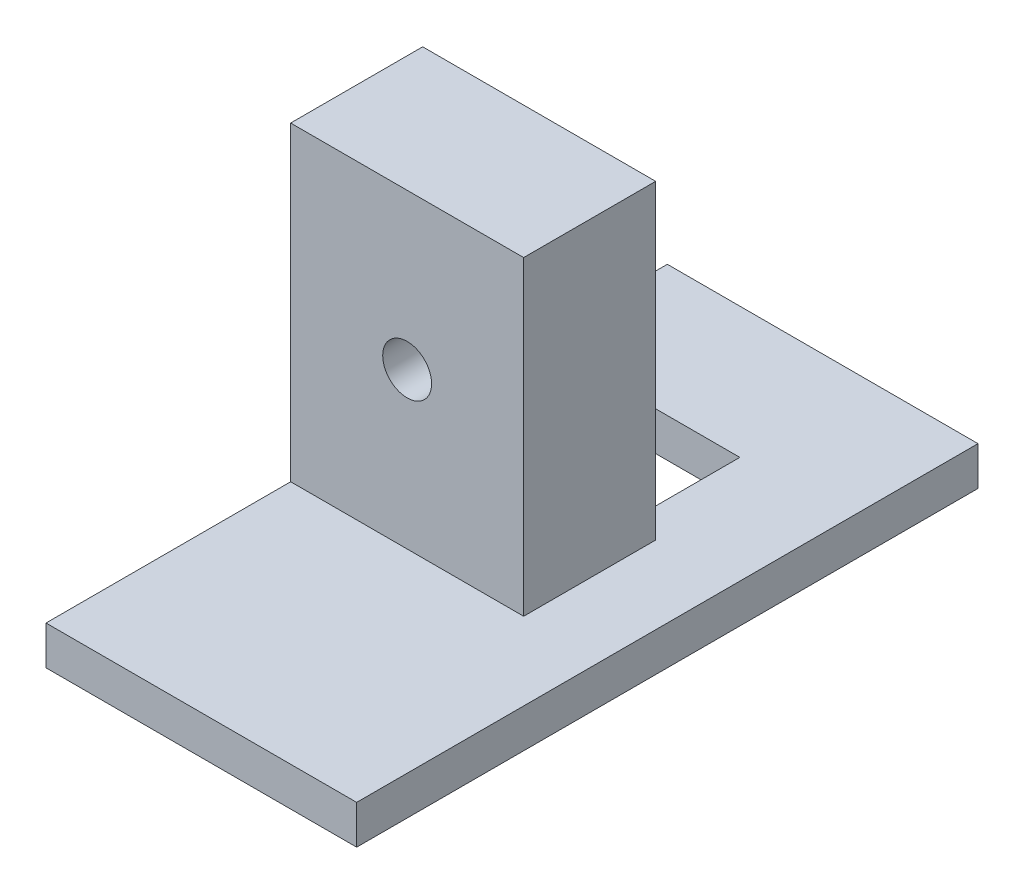
ISO-10303-21;
HEADER;
FILE_DESCRIPTION(('STEP AP214'),'2;1');
FILE_NAME('part.step','',(''),(''),'','','');
FILE_SCHEMA(('AUTOMOTIVE_DESIGN { 1 0 10303 214 1 1 1 1 }'));
ENDSEC;
DATA;
#1=APPLICATION_CONTEXT('core data for automotive mechanical design processes');
#2=APPLICATION_PROTOCOL_DEFINITION('international standard','automotive_design',2000,#1);
#3=PRODUCT_CONTEXT('',#1,'mechanical');
#4=PRODUCT('Part','Part','',(#3));
#5=PRODUCT_RELATED_PRODUCT_CATEGORY('part','',(#4));
#6=PRODUCT_DEFINITION_FORMATION('','',#4);
#7=PRODUCT_DEFINITION_CONTEXT('part definition',#1,'design');
#8=PRODUCT_DEFINITION('design','',#6,#7);
#9=PRODUCT_DEFINITION_SHAPE('','',#8);
#10=(LENGTH_UNIT() NAMED_UNIT(*) SI_UNIT(.MILLI.,.METRE.));
#11=(NAMED_UNIT(*) PLANE_ANGLE_UNIT() SI_UNIT($,.RADIAN.));
#12=(NAMED_UNIT(*) SI_UNIT($,.STERADIAN.) SOLID_ANGLE_UNIT());
#13=UNCERTAINTY_MEASURE_WITH_UNIT(LENGTH_MEASURE(1.E-05),#10,'distance_accuracy_value','');
#14=(GEOMETRIC_REPRESENTATION_CONTEXT(3) GLOBAL_UNCERTAINTY_ASSIGNED_CONTEXT((#13)) GLOBAL_UNIT_ASSIGNED_CONTEXT((#10,
#11,#12)) REPRESENTATION_CONTEXT('',''));
#15=CARTESIAN_POINT('',(0.,0.,0.));
#16=DIRECTION('',(0.,0.,1.));
#17=DIRECTION('',(1.,0.,0.));
#18=AXIS2_PLACEMENT_3D('',#15,#16,#17);
#19=CARTESIAN_POINT('',(0.,6.35,0.));
#20=DIRECTION('',(0.,-1.,0.));
#21=DIRECTION('',(0.,0.,-1.));
#22=AXIS2_PLACEMENT_3D('',#19,#20,#21);
#23=PLANE('',#22);
#24=DIRECTION('',(-1.,0.,0.));
#25=VECTOR('',#24,1.);
#26=CARTESIAN_POINT('',(7.87400000000002,6.35,-29.38272));
#27=LINE('',#26,#25);
#28=CARTESIAN_POINT('',(7.87400000000002,6.35,-29.38272));
#29=VERTEX_POINT('',#28);
#30=CARTESIAN_POINT('',(-20.574,6.35,-29.38272));
#31=VERTEX_POINT('',#30);
#32=EDGE_CURVE('E163',#29,#31,#27,.T.);
#33=ORIENTED_EDGE('',*,*,#32,.F.);
#34=DIRECTION('',(0.,0.,-1.));
#35=VECTOR('',#34,1.);
#36=CARTESIAN_POINT('',(7.87400000000002,6.35,-13.6652));
#37=LINE('',#36,#35);
#38=CARTESIAN_POINT('',(7.87400000000002,6.35,-13.6652));
#39=VERTEX_POINT('',#38);
#40=EDGE_CURVE('E55',#39,#29,#37,.T.);
#41=ORIENTED_EDGE('',*,*,#40,.F.);
#42=DIRECTION('',(1.,0.,0.));
#43=VECTOR('',#42,1.);
#44=CARTESIAN_POINT('',(7.87400000000002,6.35,-13.6652));
#45=LINE('',#44,#43);
#46=CARTESIAN_POINT('',(-20.574,6.35,-13.6652));
#47=VERTEX_POINT('',#46);
#48=EDGE_CURVE('E150',#47,#39,#45,.T.);
#49=ORIENTED_EDGE('',*,*,#48,.F.);
#50=DIRECTION('',(0.,0.,1.));
#51=VECTOR('',#50,1.);
#52=CARTESIAN_POINT('',(-20.574,6.35,-13.6652));
#53=LINE('',#52,#51);
#54=EDGE_CURVE('E154',#31,#47,#53,.T.);
#55=ORIENTED_EDGE('',*,*,#54,.F.);
#56=EDGE_LOOP('',(#33,#41,#49,#55));
#57=FACE_BOUND('',#56,.T.);
#58=DIRECTION('',(1.,0.,0.));
#59=VECTOR('',#58,1.);
#60=CARTESIAN_POINT('',(12.7,6.35,10.795));
#61=LINE('',#60,#59);
#62=CARTESIAN_POINT('',(-25.4,6.35,10.795));
#63=VERTEX_POINT('',#62);
#64=CARTESIAN_POINT('',(12.7,6.35,10.795));
#65=VERTEX_POINT('',#64);
#66=EDGE_CURVE('E186',#63,#65,#61,.T.);
#67=ORIENTED_EDGE('',*,*,#66,.F.);
#68=DIRECTION('',(0.,0.,1.));
#69=VECTOR('',#68,1.);
#70=CARTESIAN_POINT('',(-25.4,6.35,50.8));
#71=LINE('',#70,#69);
#72=CARTESIAN_POINT('',(-25.4,6.35,50.8));
#73=VERTEX_POINT('',#72);
#74=EDGE_CURVE('E231',#63,#73,#71,.T.);
#75=ORIENTED_EDGE('',*,*,#74,.T.);
#76=DIRECTION('',(1.,0.,0.));
#77=VECTOR('',#76,1.);
#78=CARTESIAN_POINT('',(-25.4,6.35,50.8));
#79=LINE('',#78,#77);
#80=CARTESIAN_POINT('',(25.4,6.35,50.8));
#81=VERTEX_POINT('',#80);
#82=EDGE_CURVE('E235',#73,#81,#79,.T.);
#83=ORIENTED_EDGE('',*,*,#82,.T.);
#84=DIRECTION('',(0.,0.,-1.));
#85=VECTOR('',#84,1.);
#86=CARTESIAN_POINT('',(25.4,6.35,50.8));
#87=LINE('',#86,#85);
#88=CARTESIAN_POINT('',(25.4,6.35,-50.8));
#89=VERTEX_POINT('',#88);
#90=EDGE_CURVE('E223',#81,#89,#87,.T.);
#91=ORIENTED_EDGE('',*,*,#90,.T.);
#92=DIRECTION('',(-1.,0.,0.));
#93=VECTOR('',#92,1.);
#94=CARTESIAN_POINT('',(-25.4,6.35,-50.8));
#95=LINE('',#94,#93);
#96=CARTESIAN_POINT('',(-25.4,6.35,-50.8));
#97=VERTEX_POINT('',#96);
#98=EDGE_CURVE('E227',#89,#97,#95,.T.);
#99=ORIENTED_EDGE('',*,*,#98,.T.);
#100=CARTESIAN_POINT('',(-25.4,6.35,-10.795));
#101=VERTEX_POINT('',#100);
#102=EDGE_CURVE('E232',#97,#101,#71,.T.);
#103=ORIENTED_EDGE('',*,*,#102,.T.);
#104=DIRECTION('',(-1.,0.,0.));
#105=VECTOR('',#104,1.);
#106=CARTESIAN_POINT('',(12.7,6.35,-10.795));
#107=LINE('',#106,#105);
#108=CARTESIAN_POINT('',(12.7,6.35,-10.795));
#109=VERTEX_POINT('',#108);
#110=EDGE_CURVE('E200',#109,#101,#107,.T.);
#111=ORIENTED_EDGE('',*,*,#110,.F.);
#112=DIRECTION('',(0.,0.,-1.));
#113=VECTOR('',#112,1.);
#114=CARTESIAN_POINT('',(12.7,6.35,-10.795));
#115=LINE('',#114,#113);
#116=EDGE_CURVE('E196',#65,#109,#115,.T.);
#117=ORIENTED_EDGE('',*,*,#116,.F.);
#118=EDGE_LOOP('',(#67,#75,#83,#91,#99,#103,#111,#117));
#119=FACE_BOUND('',#118,.T.);
#120=ADVANCED_FACE('F38',(#57,#119),#23,.F.);
#121=CARTESIAN_POINT('',(25.4,6.35,50.8));
#122=DIRECTION('',(-1.,0.,0.));
#123=DIRECTION('',(0.,0.,1.));
#124=AXIS2_PLACEMENT_3D('',#121,#122,#123);
#125=PLANE('',#124);
#126=DIRECTION('',(0.,0.,-1.));
#127=VECTOR('',#126,1.);
#128=CARTESIAN_POINT('',(25.4,0.,50.8));
#129=LINE('',#128,#127);
#130=CARTESIAN_POINT('',(25.4,0.,50.8));
#131=VERTEX_POINT('',#130);
#132=CARTESIAN_POINT('',(25.4,0.,-50.8));
#133=VERTEX_POINT('',#132);
#134=EDGE_CURVE('E222',#131,#133,#129,.T.);
#135=ORIENTED_EDGE('',*,*,#134,.T.);
#136=DIRECTION('',(0.,-1.,0.));
#137=VECTOR('',#136,1.);
#138=CARTESIAN_POINT('',(25.4,6.35,-50.8));
#139=LINE('',#138,#137);
#140=EDGE_CURVE('E11',#89,#133,#139,.T.);
#141=ORIENTED_EDGE('',*,*,#140,.F.);
#142=ORIENTED_EDGE('',*,*,#90,.F.);
#143=DIRECTION('',(0.,-1.,0.));
#144=VECTOR('',#143,1.);
#145=CARTESIAN_POINT('',(25.4,6.35,50.8));
#146=LINE('',#145,#144);
#147=EDGE_CURVE('E238',#81,#131,#146,.T.);
#148=ORIENTED_EDGE('',*,*,#147,.T.);
#149=EDGE_LOOP('',(#135,#141,#142,#148));
#150=FACE_BOUND('',#149,.T.);
#151=ADVANCED_FACE('F40',(#150),#125,.F.);
#152=CARTESIAN_POINT('',(-25.4,6.35,-50.8));
#153=DIRECTION('',(0.,0.,1.));
#154=DIRECTION('',(1.,0.,0.));
#155=AXIS2_PLACEMENT_3D('',#152,#153,#154);
#156=PLANE('',#155);
#157=DIRECTION('',(-1.,0.,0.));
#158=VECTOR('',#157,1.);
#159=CARTESIAN_POINT('',(-25.4,0.,-50.8));
#160=LINE('',#159,#158);
#161=CARTESIAN_POINT('',(-25.4,0.,-50.8));
#162=VERTEX_POINT('',#161);
#163=EDGE_CURVE('E242',#133,#162,#160,.T.);
#164=ORIENTED_EDGE('',*,*,#163,.T.);
#165=DIRECTION('',(0.,-1.,0.));
#166=VECTOR('',#165,1.);
#167=CARTESIAN_POINT('',(-25.4,6.35,-50.8));
#168=LINE('',#167,#166);
#169=EDGE_CURVE('E48',#97,#162,#168,.T.);
#170=ORIENTED_EDGE('',*,*,#169,.F.);
#171=ORIENTED_EDGE('',*,*,#98,.F.);
#172=ORIENTED_EDGE('',*,*,#140,.T.);
#173=EDGE_LOOP('',(#164,#170,#171,#172));
#174=FACE_BOUND('',#173,.T.);
#175=ADVANCED_FACE('F306',(#174),#156,.F.);
#176=CARTESIAN_POINT('',(-25.4,6.35,50.8));
#177=DIRECTION('',(1.,0.,0.));
#178=DIRECTION('',(0.,0.,-1.));
#179=AXIS2_PLACEMENT_3D('',#176,#177,#178);
#180=PLANE('',#179);
#181=DIRECTION('',(0.,0.,1.));
#182=VECTOR('',#181,1.);
#183=CARTESIAN_POINT('',(-25.4,0.,50.8));
#184=LINE('',#183,#182);
#185=CARTESIAN_POINT('',(-25.4,0.,50.8));
#186=VERTEX_POINT('',#185);
#187=EDGE_CURVE('E245',#162,#186,#184,.T.);
#188=ORIENTED_EDGE('',*,*,#187,.T.);
#189=DIRECTION('',(0.,-1.,0.));
#190=VECTOR('',#189,1.);
#191=CARTESIAN_POINT('',(-25.4,6.35,50.8));
#192=LINE('',#191,#190);
#193=EDGE_CURVE('E253',#73,#186,#192,.T.);
#194=ORIENTED_EDGE('',*,*,#193,.F.);
#195=ORIENTED_EDGE('',*,*,#74,.F.);
#196=DIRECTION('',(0.,-1.,0.));
#197=VECTOR('',#196,1.);
#198=CARTESIAN_POINT('',(-25.4,57.15,10.795));
#199=LINE('',#198,#197);
#200=CARTESIAN_POINT('',(-25.4,57.15,10.795));
#201=VERTEX_POINT('',#200);
#202=EDGE_CURVE('E210',#201,#63,#199,.T.);
#203=ORIENTED_EDGE('',*,*,#202,.F.);
#204=DIRECTION('',(0.,0.,1.));
#205=VECTOR('',#204,1.);
#206=CARTESIAN_POINT('',(-25.4,57.15,-10.795));
#207=LINE('',#206,#205);
#208=CARTESIAN_POINT('',(-25.4,57.15,-10.795));
#209=VERTEX_POINT('',#208);
#210=EDGE_CURVE('E189',#209,#201,#207,.T.);
#211=ORIENTED_EDGE('',*,*,#210,.F.);
#212=DIRECTION('',(0.,-1.,0.));
#213=VECTOR('',#212,1.);
#214=CARTESIAN_POINT('',(-25.4,57.15,-10.795));
#215=LINE('',#214,#213);
#216=EDGE_CURVE('E214',#209,#101,#215,.T.);
#217=ORIENTED_EDGE('',*,*,#216,.T.);
#218=ORIENTED_EDGE('',*,*,#102,.F.);
#219=ORIENTED_EDGE('',*,*,#169,.T.);
#220=EDGE_LOOP('',(#188,#194,#195,#203,#211,#217,#218,#219));
#221=FACE_BOUND('',#220,.T.);
#222=ADVANCED_FACE('F263',(#221),#180,.F.);
#223=CARTESIAN_POINT('',(-25.4,6.35,50.8));
#224=DIRECTION('',(0.,0.,-1.));
#225=DIRECTION('',(-1.,0.,0.));
#226=AXIS2_PLACEMENT_3D('',#223,#224,#225);
#227=PLANE('',#226);
#228=DIRECTION('',(1.,0.,0.));
#229=VECTOR('',#228,1.);
#230=CARTESIAN_POINT('',(-25.4,0.,50.8));
#231=LINE('',#230,#229);
#232=EDGE_CURVE('E228',#186,#131,#231,.T.);
#233=ORIENTED_EDGE('',*,*,#232,.T.);
#234=ORIENTED_EDGE('',*,*,#147,.F.);
#235=ORIENTED_EDGE('',*,*,#82,.F.);
#236=ORIENTED_EDGE('',*,*,#193,.T.);
#237=EDGE_LOOP('',(#233,#234,#235,#236));
#238=FACE_BOUND('',#237,.T.);
#239=ADVANCED_FACE('F270',(#238),#227,.F.);
#240=CARTESIAN_POINT('',(0.,0.,0.));
#241=DIRECTION('',(0.,-1.,0.));
#242=DIRECTION('',(0.,0.,-1.));
#243=AXIS2_PLACEMENT_3D('',#240,#241,#242);
#244=PLANE('',#243);
#245=DIRECTION('',(0.,0.,-1.));
#246=VECTOR('',#245,1.);
#247=CARTESIAN_POINT('',(7.87400000000002,0.,-13.6652));
#248=LINE('',#247,#246);
#249=CARTESIAN_POINT('',(7.87400000000002,0.,-13.6652));
#250=VERTEX_POINT('',#249);
#251=CARTESIAN_POINT('',(7.87400000000002,0.,-29.38272));
#252=VERTEX_POINT('',#251);
#253=EDGE_CURVE('E131',#250,#252,#248,.T.);
#254=ORIENTED_EDGE('',*,*,#253,.T.);
#255=DIRECTION('',(-1.,0.,0.));
#256=VECTOR('',#255,1.);
#257=CARTESIAN_POINT('',(7.87400000000002,0.,-29.38272));
#258=LINE('',#257,#256);
#259=CARTESIAN_POINT('',(-20.574,0.,-29.38272));
#260=VERTEX_POINT('',#259);
#261=EDGE_CURVE('E141',#252,#260,#258,.T.);
#262=ORIENTED_EDGE('',*,*,#261,.T.);
#263=DIRECTION('',(0.,0.,1.));
#264=VECTOR('',#263,1.);
#265=CARTESIAN_POINT('',(-20.574,0.,-13.6652));
#266=LINE('',#265,#264);
#267=CARTESIAN_POINT('',(-20.574,0.,-13.6652));
#268=VERTEX_POINT('',#267);
#269=EDGE_CURVE('E63',#260,#268,#266,.T.);
#270=ORIENTED_EDGE('',*,*,#269,.T.);
#271=DIRECTION('',(1.,0.,0.));
#272=VECTOR('',#271,1.);
#273=CARTESIAN_POINT('',(7.87400000000002,0.,-13.6652));
#274=LINE('',#273,#272);
#275=EDGE_CURVE('E138',#268,#250,#274,.T.);
#276=ORIENTED_EDGE('',*,*,#275,.T.);
#277=EDGE_LOOP('',(#254,#262,#270,#276));
#278=FACE_BOUND('',#277,.T.);
#279=ORIENTED_EDGE('',*,*,#134,.F.);
#280=ORIENTED_EDGE('',*,*,#232,.F.);
#281=ORIENTED_EDGE('',*,*,#187,.F.);
#282=ORIENTED_EDGE('',*,*,#163,.F.);
#283=EDGE_LOOP('',(#279,#280,#281,#282));
#284=FACE_BOUND('',#283,.T.);
#285=ADVANCED_FACE('F146',(#278,#284),#244,.T.);
#286=CARTESIAN_POINT('',(12.7,57.15,-10.795));
#287=DIRECTION('',(-1.,0.,0.));
#288=DIRECTION('',(0.,0.,1.));
#289=AXIS2_PLACEMENT_3D('',#286,#287,#288);
#290=PLANE('',#289);
#291=ORIENTED_EDGE('',*,*,#116,.T.);
#292=DIRECTION('',(0.,-1.,0.));
#293=VECTOR('',#292,1.);
#294=CARTESIAN_POINT('',(12.7,57.15,-10.795));
#295=LINE('',#294,#293);
#296=CARTESIAN_POINT('',(12.7,57.15,-10.795));
#297=VERTEX_POINT('',#296);
#298=EDGE_CURVE('E218',#297,#109,#295,.T.);
#299=ORIENTED_EDGE('',*,*,#298,.F.);
#300=DIRECTION('',(0.,0.,-1.));
#301=VECTOR('',#300,1.);
#302=CARTESIAN_POINT('',(12.7,57.15,-10.795));
#303=LINE('',#302,#301);
#304=CARTESIAN_POINT('',(12.7,57.15,10.795));
#305=VERTEX_POINT('',#304);
#306=EDGE_CURVE('E181',#305,#297,#303,.T.);
#307=ORIENTED_EDGE('',*,*,#306,.F.);
#308=DIRECTION('',(0.,-1.,0.));
#309=VECTOR('',#308,1.);
#310=CARTESIAN_POINT('',(12.7,57.15,10.795));
#311=LINE('',#310,#309);
#312=EDGE_CURVE('E195',#305,#65,#311,.T.);
#313=ORIENTED_EDGE('',*,*,#312,.T.);
#314=EDGE_LOOP('',(#291,#299,#307,#313));
#315=FACE_BOUND('',#314,.T.);
#316=ADVANCED_FACE('F309',(#315),#290,.F.);
#317=CARTESIAN_POINT('',(12.7,57.15,-10.795));
#318=DIRECTION('',(0.,0.,1.));
#319=DIRECTION('',(1.,0.,0.));
#320=AXIS2_PLACEMENT_3D('',#317,#318,#319);
#321=PLANE('',#320);
#322=CARTESIAN_POINT('',(-6.35,31.75,-10.795));
#323=DIRECTION('',(0.,0.,-1.));
#324=DIRECTION('',(-1.,0.,0.));
#325=AXIS2_PLACEMENT_3D('',#322,#323,#324);
#326=CIRCLE('',#325,4.00000000000001);
#327=CARTESIAN_POINT('',(-10.35,31.75,-10.795));
#328=VERTEX_POINT('',#327);
#329=EDGE_CURVE('E172',#328,#328,#326,.T.);
#330=ORIENTED_EDGE('',*,*,#329,.F.);
#331=EDGE_LOOP('',(#330));
#332=FACE_BOUND('',#331,.T.);
#333=ORIENTED_EDGE('',*,*,#110,.T.);
#334=ORIENTED_EDGE('',*,*,#216,.F.);
#335=DIRECTION('',(-1.,0.,0.));
#336=VECTOR('',#335,1.);
#337=CARTESIAN_POINT('',(12.7,57.15,-10.795));
#338=LINE('',#337,#336);
#339=EDGE_CURVE('E185',#297,#209,#338,.T.);
#340=ORIENTED_EDGE('',*,*,#339,.F.);
#341=ORIENTED_EDGE('',*,*,#298,.T.);
#342=EDGE_LOOP('',(#333,#334,#340,#341));
#343=FACE_BOUND('',#342,.T.);
#344=ADVANCED_FACE('F342',(#332,#343),#321,.F.);
#345=CARTESIAN_POINT('',(12.7,57.15,10.795));
#346=DIRECTION('',(0.,0.,-1.));
#347=DIRECTION('',(-1.,0.,0.));
#348=AXIS2_PLACEMENT_3D('',#345,#346,#347);
#349=PLANE('',#348);
#350=CARTESIAN_POINT('',(-6.34999999999999,31.75,10.795));
#351=DIRECTION('',(0.,0.,-1.));
#352=DIRECTION('',(-1.,0.,0.));
#353=AXIS2_PLACEMENT_3D('',#350,#351,#352);
#354=CIRCLE('',#353,4.00000000000001);
#355=CARTESIAN_POINT('',(-10.35,31.75,10.795));
#356=VERTEX_POINT('',#355);
#357=EDGE_CURVE('E42',#356,#356,#354,.T.);
#358=ORIENTED_EDGE('',*,*,#357,.T.);
#359=EDGE_LOOP('',(#358));
#360=FACE_BOUND('',#359,.T.);
#361=ORIENTED_EDGE('',*,*,#66,.T.);
#362=ORIENTED_EDGE('',*,*,#312,.F.);
#363=DIRECTION('',(1.,0.,0.));
#364=VECTOR('',#363,1.);
#365=CARTESIAN_POINT('',(12.7,57.15,10.795));
#366=LINE('',#365,#364);
#367=EDGE_CURVE('E192',#201,#305,#366,.T.);
#368=ORIENTED_EDGE('',*,*,#367,.F.);
#369=ORIENTED_EDGE('',*,*,#202,.T.);
#370=EDGE_LOOP('',(#361,#362,#368,#369));
#371=FACE_BOUND('',#370,.T.);
#372=ADVANCED_FACE('F283',(#360,#371),#349,.F.);
#373=CARTESIAN_POINT('',(0.,57.15,0.));
#374=DIRECTION('',(0.,-1.,0.));
#375=DIRECTION('',(0.,0.,-1.));
#376=AXIS2_PLACEMENT_3D('',#373,#374,#375);
#377=PLANE('',#376);
#378=ORIENTED_EDGE('',*,*,#306,.T.);
#379=ORIENTED_EDGE('',*,*,#339,.T.);
#380=ORIENTED_EDGE('',*,*,#210,.T.);
#381=ORIENTED_EDGE('',*,*,#367,.T.);
#382=EDGE_LOOP('',(#378,#379,#380,#381));
#383=FACE_BOUND('',#382,.T.);
#384=ADVANCED_FACE('F288',(#383),#377,.F.);
#385=CARTESIAN_POINT('',(-6.34999999999999,31.75,50.8));
#386=DIRECTION('',(0.,0.,-1.));
#387=DIRECTION('',(-1.,0.,0.));
#388=AXIS2_PLACEMENT_3D('',#385,#386,#387);
#389=CYLINDRICAL_SURFACE('',#388,4.00000000000001);
#390=ORIENTED_EDGE('',*,*,#329,.T.);
#391=EDGE_LOOP('',(#390));
#392=FACE_BOUND('',#391,.T.);
#393=ORIENTED_EDGE('',*,*,#357,.F.);
#394=EDGE_LOOP('',(#393));
#395=FACE_BOUND('',#394,.T.);
#396=ADVANCED_FACE('F286',(#392,#395),#389,.F.);
#397=CARTESIAN_POINT('',(7.87400000000002,0.,-13.6652));
#398=DIRECTION('',(1.,0.,0.));
#399=DIRECTION('',(0.,0.,-1.));
#400=AXIS2_PLACEMENT_3D('',#397,#398,#399);
#401=PLANE('',#400);
#402=ORIENTED_EDGE('',*,*,#40,.T.);
#403=DIRECTION('',(0.,1.,0.));
#404=VECTOR('',#403,1.);
#405=CARTESIAN_POINT('',(7.87400000000002,0.,-29.38272));
#406=LINE('',#405,#404);
#407=EDGE_CURVE('E127',#252,#29,#406,.T.);
#408=ORIENTED_EDGE('',*,*,#407,.F.);
#409=ORIENTED_EDGE('',*,*,#253,.F.);
#410=DIRECTION('',(0.,1.,0.));
#411=VECTOR('',#410,1.);
#412=CARTESIAN_POINT('',(7.87400000000002,0.,-13.6652));
#413=LINE('',#412,#411);
#414=EDGE_CURVE('E169',#250,#39,#413,.T.);
#415=ORIENTED_EDGE('',*,*,#414,.T.);
#416=EDGE_LOOP('',(#402,#408,#409,#415));
#417=FACE_BOUND('',#416,.T.);
#418=ADVANCED_FACE('F129',(#417),#401,.F.);
#419=CARTESIAN_POINT('',(7.87400000000002,0.,-13.6652));
#420=DIRECTION('',(0.,0.,1.));
#421=DIRECTION('',(1.,0.,0.));
#422=AXIS2_PLACEMENT_3D('',#419,#420,#421);
#423=PLANE('',#422);
#424=ORIENTED_EDGE('',*,*,#48,.T.);
#425=ORIENTED_EDGE('',*,*,#414,.F.);
#426=ORIENTED_EDGE('',*,*,#275,.F.);
#427=DIRECTION('',(0.,1.,0.));
#428=VECTOR('',#427,1.);
#429=CARTESIAN_POINT('',(-20.574,0.,-13.6652));
#430=LINE('',#429,#428);
#431=EDGE_CURVE('E173',#268,#47,#430,.T.);
#432=ORIENTED_EDGE('',*,*,#431,.T.);
#433=EDGE_LOOP('',(#424,#425,#426,#432));
#434=FACE_BOUND('',#433,.T.);
#435=ADVANCED_FACE('F295',(#434),#423,.F.);
#436=CARTESIAN_POINT('',(-20.574,0.,-13.6652));
#437=DIRECTION('',(-1.,0.,0.));
#438=DIRECTION('',(0.,0.,1.));
#439=AXIS2_PLACEMENT_3D('',#436,#437,#438);
#440=PLANE('',#439);
#441=ORIENTED_EDGE('',*,*,#54,.T.);
#442=ORIENTED_EDGE('',*,*,#431,.F.);
#443=ORIENTED_EDGE('',*,*,#269,.F.);
#444=DIRECTION('',(0.,1.,0.));
#445=VECTOR('',#444,1.);
#446=CARTESIAN_POINT('',(-20.574,0.,-29.38272));
#447=LINE('',#446,#445);
#448=EDGE_CURVE('E137',#260,#31,#447,.T.);
#449=ORIENTED_EDGE('',*,*,#448,.T.);
#450=EDGE_LOOP('',(#441,#442,#443,#449));
#451=FACE_BOUND('',#450,.T.);
#452=ADVANCED_FACE('F379',(#451),#440,.F.);
#453=CARTESIAN_POINT('',(7.87400000000002,0.,-29.38272));
#454=DIRECTION('',(0.,0.,-1.));
#455=DIRECTION('',(-1.,0.,0.));
#456=AXIS2_PLACEMENT_3D('',#453,#454,#455);
#457=PLANE('',#456);
#458=ORIENTED_EDGE('',*,*,#32,.T.);
#459=ORIENTED_EDGE('',*,*,#448,.F.);
#460=ORIENTED_EDGE('',*,*,#261,.F.);
#461=ORIENTED_EDGE('',*,*,#407,.T.);
#462=EDGE_LOOP('',(#458,#459,#460,#461));
#463=FACE_BOUND('',#462,.T.);
#464=ADVANCED_FACE('F142',(#463),#457,.F.);
#465=CLOSED_SHELL('',(#120,#151,#175,#222,#239,#285,#316,#344,#372,#384,#396,#418,#435,#452,#464));
#466=MANIFOLD_SOLID_BREP('B2',#465);
#467=ADVANCED_BREP_SHAPE_REPRESENTATION('',(#18,#466),#14);
#468=SHAPE_DEFINITION_REPRESENTATION(#9,#467);
ENDSEC;
END-ISO-10303-21;
